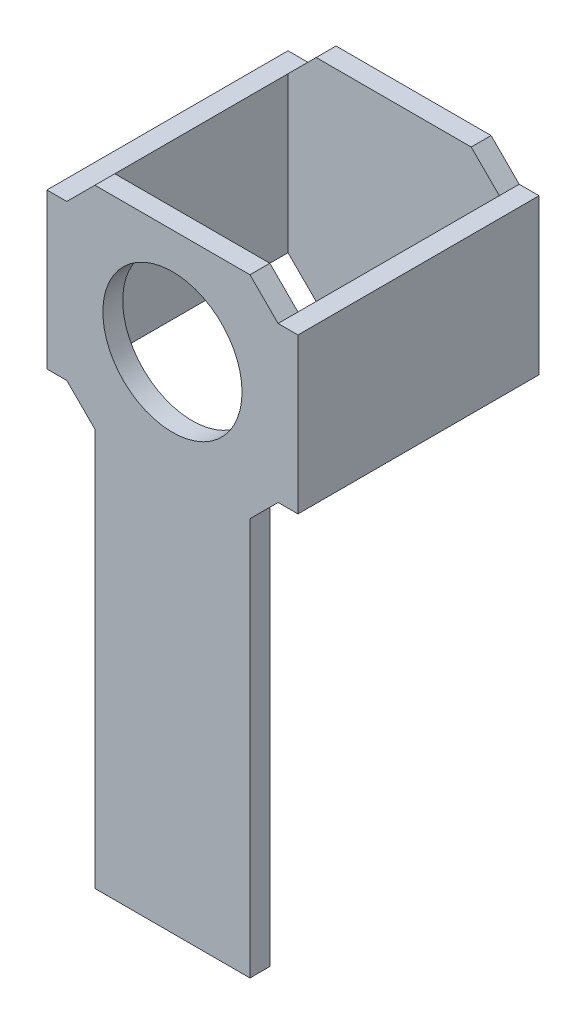
ISO-10303-21;
HEADER;
FILE_DESCRIPTION(('STEP AP214'),'2;1');
FILE_NAME('part.step','',(''),(''),'','','');
FILE_SCHEMA(('AUTOMOTIVE_DESIGN { 1 0 10303 214 1 1 1 1 }'));
ENDSEC;
DATA;
#1=APPLICATION_CONTEXT('core data for automotive mechanical design processes');
#2=APPLICATION_PROTOCOL_DEFINITION('international standard','automotive_design',2000,#1);
#3=PRODUCT_CONTEXT('',#1,'mechanical');
#4=PRODUCT('Part','Part','',(#3));
#5=PRODUCT_RELATED_PRODUCT_CATEGORY('part','',(#4));
#6=PRODUCT_DEFINITION_FORMATION('','',#4);
#7=PRODUCT_DEFINITION_CONTEXT('part definition',#1,'design');
#8=PRODUCT_DEFINITION('design','',#6,#7);
#9=PRODUCT_DEFINITION_SHAPE('','',#8);
#10=(LENGTH_UNIT() NAMED_UNIT(*) SI_UNIT(.MILLI.,.METRE.));
#11=(NAMED_UNIT(*) PLANE_ANGLE_UNIT() SI_UNIT($,.RADIAN.));
#12=(NAMED_UNIT(*) SI_UNIT($,.STERADIAN.) SOLID_ANGLE_UNIT());
#13=UNCERTAINTY_MEASURE_WITH_UNIT(LENGTH_MEASURE(1.E-05),#10,'distance_accuracy_value','');
#14=(GEOMETRIC_REPRESENTATION_CONTEXT(3) GLOBAL_UNCERTAINTY_ASSIGNED_CONTEXT((#13)) GLOBAL_UNIT_ASSIGNED_CONTEXT((#10,
#11,#12)) REPRESENTATION_CONTEXT('',''));
#15=CARTESIAN_POINT('',(0.,0.,0.));
#16=DIRECTION('',(0.,0.,1.));
#17=DIRECTION('',(1.,0.,0.));
#18=AXIS2_PLACEMENT_3D('',#15,#16,#17);
#19=CARTESIAN_POINT('',(0.,0.,4.));
#20=DIRECTION('',(0.,0.,-1.));
#21=DIRECTION('',(-1.,0.,0.));
#22=AXIS2_PLACEMENT_3D('',#19,#20,#21);
#23=PLANE('',#22);
#24=CARTESIAN_POINT('',(0.,0.,4.));
#25=DIRECTION('',(0.,0.,1.));
#26=DIRECTION('',(1.,0.,0.));
#27=AXIS2_PLACEMENT_3D('',#24,#25,#26);
#28=CIRCLE('',#27,14.);
#29=CARTESIAN_POINT('',(14.,0.,4.));
#30=VERTEX_POINT('',#29);
#31=EDGE_CURVE('E230',#30,#30,#28,.T.);
#32=ORIENTED_EDGE('',*,*,#31,.F.);
#33=EDGE_LOOP('',(#32));
#34=FACE_BOUND('',#33,.T.);
#35=DIRECTION('',(0.707106781186556,-0.707106781186539,0.));
#36=VECTOR('',#35,1.);
#37=CARTESIAN_POINT('',(15.5931457505076,21.25,4.));
#38=LINE('',#37,#36);
#39=CARTESIAN_POINT('',(15.5931457505076,21.25,4.));
#40=VERTEX_POINT('',#39);
#41=CARTESIAN_POINT('',(21.25,15.5931457505077,4.));
#42=VERTEX_POINT('',#41);
#43=EDGE_CURVE('E206',#40,#42,#38,.T.);
#44=ORIENTED_EDGE('',*,*,#43,.F.);
#45=DIRECTION('',(-1.,0.,0.));
#46=VECTOR('',#45,1.);
#47=CARTESIAN_POINT('',(21.25,21.25,4.));
#48=LINE('',#47,#46);
#49=CARTESIAN_POINT('',(-15.5931457505077,21.25,4.));
#50=VERTEX_POINT('',#49);
#51=EDGE_CURVE('E218',#40,#50,#48,.T.);
#52=ORIENTED_EDGE('',*,*,#51,.T.);
#53=DIRECTION('',(0.70710678118654,0.707106781186556,0.));
#54=VECTOR('',#53,1.);
#55=CARTESIAN_POINT('',(-15.5931457505077,21.25,4.));
#56=LINE('',#55,#54);
#57=CARTESIAN_POINT('',(-21.25,15.5931457505075,4.));
#58=VERTEX_POINT('',#57);
#59=EDGE_CURVE('E240',#58,#50,#56,.T.);
#60=ORIENTED_EDGE('',*,*,#59,.F.);
#61=DIRECTION('',(1.,0.,0.));
#62=VECTOR('',#61,1.);
#63=CARTESIAN_POINT('',(-25.25,15.5931457505075,4.));
#64=LINE('',#63,#62);
#65=CARTESIAN_POINT('',(-25.25,15.5931457505075,4.));
#66=VERTEX_POINT('',#65);
#67=EDGE_CURVE('E259',#66,#58,#64,.T.);
#68=ORIENTED_EDGE('',*,*,#67,.F.);
#69=DIRECTION('',(0.,1.,0.));
#70=VECTOR('',#69,1.);
#71=CARTESIAN_POINT('',(-25.25,15.5931457505075,4.));
#72=LINE('',#71,#70);
#73=CARTESIAN_POINT('',(-25.25,-15.5931457505077,4.));
#74=VERTEX_POINT('',#73);
#75=EDGE_CURVE('E265',#74,#66,#72,.T.);
#76=ORIENTED_EDGE('',*,*,#75,.F.);
#77=DIRECTION('',(1.,0.,0.));
#78=VECTOR('',#77,1.);
#79=CARTESIAN_POINT('',(-25.25,-15.5931457505077,4.));
#80=LINE('',#79,#78);
#81=CARTESIAN_POINT('',(-21.25,-15.5931457505077,4.));
#82=VERTEX_POINT('',#81);
#83=EDGE_CURVE('E247',#74,#82,#80,.T.);
#84=ORIENTED_EDGE('',*,*,#83,.T.);
#85=DIRECTION('',(-0.707106781186555,0.70710678118654,0.));
#86=VECTOR('',#85,1.);
#87=CARTESIAN_POINT('',(-21.25,-15.5931457505077,4.));
#88=LINE('',#87,#86);
#89=CARTESIAN_POINT('',(-15.5931457505076,-21.25,4.));
#90=VERTEX_POINT('',#89);
#91=EDGE_CURVE('E238',#90,#82,#88,.T.);
#92=ORIENTED_EDGE('',*,*,#91,.F.);
#93=DIRECTION('',(0.,-1.,0.));
#94=VECTOR('',#93,1.);
#95=CARTESIAN_POINT('',(-15.5931457505076,-21.25,4.));
#96=LINE('',#95,#94);
#97=CARTESIAN_POINT('',(-15.5931457505075,-101.25,4.));
#98=VERTEX_POINT('',#97);
#99=EDGE_CURVE('E371',#90,#98,#96,.T.);
#100=ORIENTED_EDGE('',*,*,#99,.T.);
#101=DIRECTION('',(1.,0.,0.));
#102=VECTOR('',#101,1.);
#103=CARTESIAN_POINT('',(15.5931457505077,-101.25,4.));
#104=LINE('',#103,#102);
#105=CARTESIAN_POINT('',(15.5931457505077,-101.25,4.));
#106=VERTEX_POINT('',#105);
#107=EDGE_CURVE('E197',#98,#106,#104,.T.);
#108=ORIENTED_EDGE('',*,*,#107,.T.);
#109=DIRECTION('',(0.,1.,0.));
#110=VECTOR('',#109,1.);
#111=CARTESIAN_POINT('',(15.5931457505077,-21.25,4.));
#112=LINE('',#111,#110);
#113=CARTESIAN_POINT('',(15.5931457505077,-21.25,4.));
#114=VERTEX_POINT('',#113);
#115=EDGE_CURVE('E372',#106,#114,#112,.T.);
#116=ORIENTED_EDGE('',*,*,#115,.T.);
#117=DIRECTION('',(-0.707106781186539,-0.707106781186556,0.));
#118=VECTOR('',#117,1.);
#119=CARTESIAN_POINT('',(15.5931457505077,-21.25,4.));
#120=LINE('',#119,#118);
#121=CARTESIAN_POINT('',(21.25,-15.5931457505076,4.));
#122=VERTEX_POINT('',#121);
#123=EDGE_CURVE('E204',#122,#114,#120,.T.);
#124=ORIENTED_EDGE('',*,*,#123,.F.);
#125=DIRECTION('',(-1.,0.,0.));
#126=VECTOR('',#125,1.);
#127=CARTESIAN_POINT('',(25.25,-15.5931457505077,4.));
#128=LINE('',#127,#126);
#129=CARTESIAN_POINT('',(25.25,-15.5931457505077,4.));
#130=VERTEX_POINT('',#129);
#131=EDGE_CURVE('E275',#130,#122,#128,.T.);
#132=ORIENTED_EDGE('',*,*,#131,.F.);
#133=DIRECTION('',(0.,-1.,0.));
#134=VECTOR('',#133,1.);
#135=CARTESIAN_POINT('',(25.25,15.5931457505075,4.));
#136=LINE('',#135,#134);
#137=CARTESIAN_POINT('',(25.25,15.5931457505075,4.));
#138=VERTEX_POINT('',#137);
#139=EDGE_CURVE('E287',#138,#130,#136,.T.);
#140=ORIENTED_EDGE('',*,*,#139,.F.);
#141=DIRECTION('',(-1.,0.,0.));
#142=VECTOR('',#141,1.);
#143=CARTESIAN_POINT('',(25.25,15.5931457505075,4.));
#144=LINE('',#143,#142);
#145=EDGE_CURVE('E276',#138,#42,#144,.T.);
#146=ORIENTED_EDGE('',*,*,#145,.T.);
#147=EDGE_LOOP('',(#44,#52,#60,#68,#76,#84,#92,#100,#108,#116,#124,#132,#140,#146));
#148=FACE_BOUND('',#147,.T.);
#149=ADVANCED_FACE('F39',(#34,#148),#23,.F.);
#150=CARTESIAN_POINT('',(21.25,21.25,4.));
#151=DIRECTION('',(0.,-1.,0.));
#152=DIRECTION('',(0.,0.,-1.));
#153=AXIS2_PLACEMENT_3D('',#150,#151,#152);
#154=PLANE('',#153);
#155=DIRECTION('',(0.,0.,1.));
#156=VECTOR('',#155,1.);
#157=CARTESIAN_POINT('',(15.5931457505076,21.25,-6.));
#158=LINE('',#157,#156);
#159=CARTESIAN_POINT('',(15.5931457505076,21.25,0.));
#160=VERTEX_POINT('',#159);
#161=EDGE_CURVE('E245',#160,#40,#158,.T.);
#162=ORIENTED_EDGE('',*,*,#161,.F.);
#163=DIRECTION('',(-1.,0.,0.));
#164=VECTOR('',#163,1.);
#165=CARTESIAN_POINT('',(21.25,21.25,0.));
#166=LINE('',#165,#164);
#167=CARTESIAN_POINT('',(-15.5931457505077,21.25,0.));
#168=VERTEX_POINT('',#167);
#169=EDGE_CURVE('E221',#160,#168,#166,.T.);
#170=ORIENTED_EDGE('',*,*,#169,.T.);
#171=DIRECTION('',(0.,0.,1.));
#172=VECTOR('',#171,1.);
#173=CARTESIAN_POINT('',(-15.5931457505077,21.25,-6.));
#174=LINE('',#173,#172);
#175=EDGE_CURVE('E53',#168,#50,#174,.T.);
#176=ORIENTED_EDGE('',*,*,#175,.T.);
#177=ORIENTED_EDGE('',*,*,#51,.F.);
#178=EDGE_LOOP('',(#162,#170,#176,#177));
#179=FACE_BOUND('',#178,.T.);
#180=ADVANCED_FACE('F41',(#179),#154,.F.);
#181=CARTESIAN_POINT('',(0.,0.,0.));
#182=DIRECTION('',(0.,0.,-1.));
#183=DIRECTION('',(-1.,0.,0.));
#184=AXIS2_PLACEMENT_3D('',#181,#182,#183);
#185=PLANE('',#184);
#186=DIRECTION('',(-0.707106781186556,0.707106781186539,0.));
#187=VECTOR('',#186,1.);
#188=CARTESIAN_POINT('',(18.4215728752536,18.421572875254,0.));
#189=LINE('',#188,#187);
#190=CARTESIAN_POINT('',(21.25,15.5931457505075,0.));
#191=VERTEX_POINT('',#190);
#192=EDGE_CURVE('E11',#191,#160,#189,.T.);
#193=ORIENTED_EDGE('',*,*,#192,.F.);
#194=DIRECTION('',(0.,1.,0.));
#195=VECTOR('',#194,1.);
#196=CARTESIAN_POINT('',(21.25,-21.25,0.));
#197=LINE('',#196,#195);
#198=CARTESIAN_POINT('',(21.25,-15.5931457505076,0.));
#199=VERTEX_POINT('',#198);
#200=EDGE_CURVE('E211',#199,#191,#197,.T.);
#201=ORIENTED_EDGE('',*,*,#200,.F.);
#202=DIRECTION('',(0.707106781186539,0.707106781186556,0.));
#203=VECTOR('',#202,1.);
#204=CARTESIAN_POINT('',(18.421572875254,-18.4215728752536,0.));
#205=LINE('',#204,#203);
#206=CARTESIAN_POINT('',(15.5931457505077,-21.25,0.));
#207=VERTEX_POINT('',#206);
#208=EDGE_CURVE('E50',#207,#199,#205,.T.);
#209=ORIENTED_EDGE('',*,*,#208,.F.);
#210=DIRECTION('',(0.,1.,0.));
#211=VECTOR('',#210,1.);
#212=CARTESIAN_POINT('',(15.5931457505077,-21.25,0.));
#213=LINE('',#212,#211);
#214=CARTESIAN_POINT('',(15.5931457505077,-101.25,0.));
#215=VERTEX_POINT('',#214);
#216=EDGE_CURVE('E183',#215,#207,#213,.T.);
#217=ORIENTED_EDGE('',*,*,#216,.F.);
#218=DIRECTION('',(1.,0.,0.));
#219=VECTOR('',#218,1.);
#220=CARTESIAN_POINT('',(15.5931457505077,-101.25,0.));
#221=LINE('',#220,#219);
#222=CARTESIAN_POINT('',(-15.5931457505075,-101.25,0.));
#223=VERTEX_POINT('',#222);
#224=EDGE_CURVE('E370',#223,#215,#221,.T.);
#225=ORIENTED_EDGE('',*,*,#224,.F.);
#226=DIRECTION('',(0.,-1.,0.));
#227=VECTOR('',#226,1.);
#228=CARTESIAN_POINT('',(-15.5931457505076,-21.25,0.));
#229=LINE('',#228,#227);
#230=CARTESIAN_POINT('',(-15.5931457505076,-21.25,0.));
#231=VERTEX_POINT('',#230);
#232=EDGE_CURVE('E198',#231,#223,#229,.T.);
#233=ORIENTED_EDGE('',*,*,#232,.F.);
#234=DIRECTION('',(0.707106781186555,-0.70710678118654,0.));
#235=VECTOR('',#234,1.);
#236=CARTESIAN_POINT('',(-18.4215728752536,-18.421572875254,0.));
#237=LINE('',#236,#235);
#238=CARTESIAN_POINT('',(-21.25,-15.5931457505077,0.));
#239=VERTEX_POINT('',#238);
#240=EDGE_CURVE('E213',#239,#231,#237,.T.);
#241=ORIENTED_EDGE('',*,*,#240,.F.);
#242=DIRECTION('',(0.,-1.,0.));
#243=VECTOR('',#242,1.);
#244=CARTESIAN_POINT('',(-21.25,-21.25,0.));
#245=LINE('',#244,#243);
#246=CARTESIAN_POINT('',(-21.25,15.5931457505075,0.));
#247=VERTEX_POINT('',#246);
#248=EDGE_CURVE('E222',#247,#239,#245,.T.);
#249=ORIENTED_EDGE('',*,*,#248,.F.);
#250=DIRECTION('',(-0.707106781186539,-0.707106781186556,0.));
#251=VECTOR('',#250,1.);
#252=CARTESIAN_POINT('',(-18.421572875254,18.4215728752536,0.));
#253=LINE('',#252,#251);
#254=EDGE_CURVE('E214',#168,#247,#253,.T.);
#255=ORIENTED_EDGE('',*,*,#254,.F.);
#256=ORIENTED_EDGE('',*,*,#169,.F.);
#257=EDGE_LOOP('',(#193,#201,#209,#217,#225,#233,#241,#249,#255,#256));
#258=FACE_BOUND('',#257,.T.);
#259=CARTESIAN_POINT('',(0.,0.,0.));
#260=DIRECTION('',(0.,0.,1.));
#261=DIRECTION('',(1.,0.,0.));
#262=AXIS2_PLACEMENT_3D('',#259,#260,#261);
#263=CIRCLE('',#262,14.);
#264=CARTESIAN_POINT('',(14.,0.,0.));
#265=VERTEX_POINT('',#264);
#266=EDGE_CURVE('E227',#265,#265,#263,.T.);
#267=ORIENTED_EDGE('',*,*,#266,.T.);
#268=EDGE_LOOP('',(#267));
#269=FACE_BOUND('',#268,.T.);
#270=ADVANCED_FACE('F208',(#258,#269),#185,.T.);
#271=CARTESIAN_POINT('',(0.,0.,4.));
#272=DIRECTION('',(0.,0.,-1.));
#273=DIRECTION('',(-1.,0.,0.));
#274=AXIS2_PLACEMENT_3D('',#271,#272,#273);
#275=CYLINDRICAL_SURFACE('',#274,14.);
#276=ORIENTED_EDGE('',*,*,#31,.T.);
#277=EDGE_LOOP('',(#276));
#278=FACE_BOUND('',#277,.T.);
#279=ORIENTED_EDGE('',*,*,#266,.F.);
#280=EDGE_LOOP('',(#279));
#281=FACE_BOUND('',#280,.T.);
#282=ADVANCED_FACE('F485',(#278,#281),#275,.F.);
#283=CARTESIAN_POINT('',(-15.5931457505077,21.25,-6.));
#284=DIRECTION('',(0.707106781186556,-0.70710678118654,0.));
#285=DIRECTION('',(0.707106781186539,0.707106781186556,0.));
#286=AXIS2_PLACEMENT_3D('',#283,#284,#285);
#287=PLANE('',#286);
#288=ORIENTED_EDGE('',*,*,#254,.T.);
#289=DIRECTION('',(0.,0.,1.));
#290=VECTOR('',#289,1.);
#291=CARTESIAN_POINT('',(-21.25,15.5931457505075,-6.));
#292=LINE('',#291,#290);
#293=EDGE_CURVE('E231',#247,#58,#292,.T.);
#294=ORIENTED_EDGE('',*,*,#293,.T.);
#295=ORIENTED_EDGE('',*,*,#59,.T.);
#296=ORIENTED_EDGE('',*,*,#175,.F.);
#297=EDGE_LOOP('',(#288,#294,#295,#296));
#298=FACE_BOUND('',#297,.T.);
#299=ADVANCED_FACE('F401',(#298),#287,.F.);
#300=CARTESIAN_POINT('',(-21.25,-15.5931457505077,-6.));
#301=DIRECTION('',(0.70710678118654,0.707106781186555,0.));
#302=DIRECTION('',(-0.707106781186555,0.70710678118654,0.));
#303=AXIS2_PLACEMENT_3D('',#300,#301,#302);
#304=PLANE('',#303);
#305=ORIENTED_EDGE('',*,*,#240,.T.);
#306=DIRECTION('',(0.,0.,1.));
#307=VECTOR('',#306,1.);
#308=CARTESIAN_POINT('',(-15.5931457505076,-21.25,-6.));
#309=LINE('',#308,#307);
#310=EDGE_CURVE('E252',#231,#90,#309,.T.);
#311=ORIENTED_EDGE('',*,*,#310,.T.);
#312=ORIENTED_EDGE('',*,*,#91,.T.);
#313=DIRECTION('',(0.,0.,1.));
#314=VECTOR('',#313,1.);
#315=CARTESIAN_POINT('',(-21.25,-15.5931457505077,-6.));
#316=LINE('',#315,#314);
#317=EDGE_CURVE('E248',#239,#82,#316,.T.);
#318=ORIENTED_EDGE('',*,*,#317,.F.);
#319=EDGE_LOOP('',(#305,#311,#312,#318));
#320=FACE_BOUND('',#319,.T.);
#321=ADVANCED_FACE('F389',(#320),#304,.F.);
#322=CARTESIAN_POINT('',(15.5931457505077,-21.25,-6.));
#323=DIRECTION('',(-0.707106781186556,0.707106781186539,0.));
#324=DIRECTION('',(-0.707106781186539,-0.707106781186556,0.));
#325=AXIS2_PLACEMENT_3D('',#322,#323,#324);
#326=PLANE('',#325);
#327=ORIENTED_EDGE('',*,*,#208,.T.);
#328=DIRECTION('',(0.,0.,1.));
#329=VECTOR('',#328,1.);
#330=CARTESIAN_POINT('',(21.25,-15.5931457505076,-6.));
#331=LINE('',#330,#329);
#332=EDGE_CURVE('E202',#199,#122,#331,.T.);
#333=ORIENTED_EDGE('',*,*,#332,.T.);
#334=ORIENTED_EDGE('',*,*,#123,.T.);
#335=DIRECTION('',(0.,0.,1.));
#336=VECTOR('',#335,1.);
#337=CARTESIAN_POINT('',(15.5931457505077,-21.25,-6.));
#338=LINE('',#337,#336);
#339=EDGE_CURVE('E189',#207,#114,#338,.T.);
#340=ORIENTED_EDGE('',*,*,#339,.F.);
#341=EDGE_LOOP('',(#327,#333,#334,#340));
#342=FACE_BOUND('',#341,.T.);
#343=ADVANCED_FACE('F203',(#342),#326,.F.);
#344=CARTESIAN_POINT('',(15.5931457505076,21.25,-6.));
#345=DIRECTION('',(-0.707106781186539,-0.707106781186556,0.));
#346=DIRECTION('',(0.707106781186556,-0.707106781186539,0.));
#347=AXIS2_PLACEMENT_3D('',#344,#345,#346);
#348=PLANE('',#347);
#349=ORIENTED_EDGE('',*,*,#192,.T.);
#350=ORIENTED_EDGE('',*,*,#161,.T.);
#351=ORIENTED_EDGE('',*,*,#43,.T.);
#352=DIRECTION('',(0.,0.,1.));
#353=VECTOR('',#352,1.);
#354=CARTESIAN_POINT('',(21.25,15.5931457505077,-6.));
#355=LINE('',#354,#353);
#356=EDGE_CURVE('E241',#191,#42,#355,.T.);
#357=ORIENTED_EDGE('',*,*,#356,.F.);
#358=EDGE_LOOP('',(#349,#350,#351,#357));
#359=FACE_BOUND('',#358,.T.);
#360=ADVANCED_FACE('F410',(#359),#348,.F.);
#361=CARTESIAN_POINT('',(-21.25,0.,0.));
#362=DIRECTION('',(-1.,0.,0.));
#363=DIRECTION('',(0.,0.,1.));
#364=AXIS2_PLACEMENT_3D('',#361,#362,#363);
#365=PLANE('',#364);
#366=DIRECTION('',(0.,0.,-1.));
#367=VECTOR('',#366,1.);
#368=CARTESIAN_POINT('',(-21.25,15.5931457505075,4.));
#369=LINE('',#368,#367);
#370=CARTESIAN_POINT('',(-21.25,15.5931457505075,-40.5));
#371=VERTEX_POINT('',#370);
#372=EDGE_CURVE('E269',#247,#371,#369,.T.);
#373=ORIENTED_EDGE('',*,*,#372,.F.);
#374=ORIENTED_EDGE('',*,*,#248,.T.);
#375=DIRECTION('',(0.,0.,1.));
#376=VECTOR('',#375,1.);
#377=CARTESIAN_POINT('',(-21.25,-15.5931457505077,4.));
#378=LINE('',#377,#376);
#379=CARTESIAN_POINT('',(-21.25,-15.5931457505077,-40.5));
#380=VERTEX_POINT('',#379);
#381=EDGE_CURVE('E263',#380,#239,#378,.T.);
#382=ORIENTED_EDGE('',*,*,#381,.F.);
#383=DIRECTION('',(0.,-1.,0.));
#384=VECTOR('',#383,1.);
#385=CARTESIAN_POINT('',(-21.25,15.5931457505075,-40.5));
#386=LINE('',#385,#384);
#387=EDGE_CURVE('E270',#371,#380,#386,.T.);
#388=ORIENTED_EDGE('',*,*,#387,.F.);
#389=EDGE_LOOP('',(#373,#374,#382,#388));
#390=FACE_BOUND('',#389,.T.);
#391=ADVANCED_FACE('F397',(#390),#365,.F.);
#392=CARTESIAN_POINT('',(-25.25,15.5931457505075,4.));
#393=DIRECTION('',(0.,-1.,0.));
#394=DIRECTION('',(0.,0.,-1.));
#395=AXIS2_PLACEMENT_3D('',#392,#393,#394);
#396=PLANE('',#395);
#397=ORIENTED_EDGE('',*,*,#293,.F.);
#398=ORIENTED_EDGE('',*,*,#372,.T.);
#399=DIRECTION('',(0.,0.,1.));
#400=VECTOR('',#399,1.);
#401=CARTESIAN_POINT('',(-21.25,15.5931457505075,-44.5));
#402=LINE('',#401,#400);
#403=CARTESIAN_POINT('',(-21.25,15.5931457505075,-44.5));
#404=VERTEX_POINT('',#403);
#405=EDGE_CURVE('E312',#404,#371,#402,.T.);
#406=ORIENTED_EDGE('',*,*,#405,.F.);
#407=DIRECTION('',(1.,0.,0.));
#408=VECTOR('',#407,1.);
#409=CARTESIAN_POINT('',(-25.25,15.5931457505075,-44.5));
#410=LINE('',#409,#408);
#411=CARTESIAN_POINT('',(-25.25,15.5931457505075,-44.5));
#412=VERTEX_POINT('',#411);
#413=EDGE_CURVE('E339',#412,#404,#410,.T.);
#414=ORIENTED_EDGE('',*,*,#413,.F.);
#415=DIRECTION('',(0.,0.,-1.));
#416=VECTOR('',#415,1.);
#417=CARTESIAN_POINT('',(-25.25,15.5931457505075,4.));
#418=LINE('',#417,#416);
#419=EDGE_CURVE('E266',#66,#412,#418,.T.);
#420=ORIENTED_EDGE('',*,*,#419,.F.);
#421=ORIENTED_EDGE('',*,*,#67,.T.);
#422=EDGE_LOOP('',(#397,#398,#406,#414,#420,#421));
#423=FACE_BOUND('',#422,.T.);
#424=ADVANCED_FACE('F399',(#423),#396,.F.);
#425=CARTESIAN_POINT('',(-25.25,-15.5931457505077,4.));
#426=DIRECTION('',(0.,1.,0.));
#427=DIRECTION('',(0.,0.,1.));
#428=AXIS2_PLACEMENT_3D('',#425,#426,#427);
#429=PLANE('',#428);
#430=ORIENTED_EDGE('',*,*,#381,.T.);
#431=ORIENTED_EDGE('',*,*,#317,.T.);
#432=ORIENTED_EDGE('',*,*,#83,.F.);
#433=DIRECTION('',(0.,0.,1.));
#434=VECTOR('',#433,1.);
#435=CARTESIAN_POINT('',(-25.25,-15.5931457505077,4.));
#436=LINE('',#435,#434);
#437=CARTESIAN_POINT('',(-25.25,-15.5931457505077,-44.5));
#438=VERTEX_POINT('',#437);
#439=EDGE_CURVE('E273',#438,#74,#436,.T.);
#440=ORIENTED_EDGE('',*,*,#439,.F.);
#441=DIRECTION('',(-1.,0.,0.));
#442=VECTOR('',#441,1.);
#443=CARTESIAN_POINT('',(-21.25,-15.5931457505077,-44.5));
#444=LINE('',#443,#442);
#445=CARTESIAN_POINT('',(-21.25,-15.5931457505077,-44.5));
#446=VERTEX_POINT('',#445);
#447=EDGE_CURVE('E344',#446,#438,#444,.T.);
#448=ORIENTED_EDGE('',*,*,#447,.F.);
#449=DIRECTION('',(0.,0.,1.));
#450=VECTOR('',#449,1.);
#451=CARTESIAN_POINT('',(-21.25,-15.5931457505077,-44.5));
#452=LINE('',#451,#450);
#453=EDGE_CURVE('E315',#446,#380,#452,.T.);
#454=ORIENTED_EDGE('',*,*,#453,.T.);
#455=EDGE_LOOP('',(#430,#431,#432,#440,#448,#454));
#456=FACE_BOUND('',#455,.T.);
#457=ADVANCED_FACE('F457',(#456),#429,.F.);
#458=CARTESIAN_POINT('',(-25.25,0.,0.));
#459=DIRECTION('',(-1.,0.,0.));
#460=DIRECTION('',(0.,0.,1.));
#461=AXIS2_PLACEMENT_3D('',#458,#459,#460);
#462=PLANE('',#461);
#463=ORIENTED_EDGE('',*,*,#419,.T.);
#464=DIRECTION('',(0.,1.,0.));
#465=VECTOR('',#464,1.);
#466=CARTESIAN_POINT('',(-25.25,-15.5931457505077,-44.5));
#467=LINE('',#466,#465);
#468=EDGE_CURVE('E342',#438,#412,#467,.T.);
#469=ORIENTED_EDGE('',*,*,#468,.F.);
#470=ORIENTED_EDGE('',*,*,#439,.T.);
#471=ORIENTED_EDGE('',*,*,#75,.T.);
#472=EDGE_LOOP('',(#463,#469,#470,#471));
#473=FACE_BOUND('',#472,.T.);
#474=ADVANCED_FACE('F463',(#473),#462,.T.);
#475=CARTESIAN_POINT('',(21.25,0.,0.));
#476=DIRECTION('',(1.,0.,0.));
#477=DIRECTION('',(0.,0.,-1.));
#478=AXIS2_PLACEMENT_3D('',#475,#476,#477);
#479=PLANE('',#478);
#480=DIRECTION('',(0.,0.,-1.));
#481=VECTOR('',#480,1.);
#482=CARTESIAN_POINT('',(21.25,-15.5931457505077,4.));
#483=LINE('',#482,#481);
#484=CARTESIAN_POINT('',(21.25,-15.5931457505077,-40.5));
#485=VERTEX_POINT('',#484);
#486=EDGE_CURVE('E286',#199,#485,#483,.T.);
#487=ORIENTED_EDGE('',*,*,#486,.F.);
#488=ORIENTED_EDGE('',*,*,#200,.T.);
#489=DIRECTION('',(0.,0.,1.));
#490=VECTOR('',#489,1.);
#491=CARTESIAN_POINT('',(21.25,15.5931457505075,-40.5));
#492=LINE('',#491,#490);
#493=CARTESIAN_POINT('',(21.25,15.5931457505075,-40.5));
#494=VERTEX_POINT('',#493);
#495=EDGE_CURVE('E281',#494,#191,#492,.T.);
#496=ORIENTED_EDGE('',*,*,#495,.F.);
#497=DIRECTION('',(0.,1.,0.));
#498=VECTOR('',#497,1.);
#499=CARTESIAN_POINT('',(21.25,-15.5931457505077,-40.5));
#500=LINE('',#499,#498);
#501=EDGE_CURVE('E290',#485,#494,#500,.T.);
#502=ORIENTED_EDGE('',*,*,#501,.F.);
#503=EDGE_LOOP('',(#487,#488,#496,#502));
#504=FACE_BOUND('',#503,.T.);
#505=ADVANCED_FACE('F412',(#504),#479,.F.);
#506=CARTESIAN_POINT('',(25.25,-15.5931457505077,4.));
#507=DIRECTION('',(0.,1.,0.));
#508=DIRECTION('',(0.,0.,1.));
#509=AXIS2_PLACEMENT_3D('',#506,#507,#508);
#510=PLANE('',#509);
#511=ORIENTED_EDGE('',*,*,#332,.F.);
#512=ORIENTED_EDGE('',*,*,#486,.T.);
#513=DIRECTION('',(0.,0.,1.));
#514=VECTOR('',#513,1.);
#515=CARTESIAN_POINT('',(21.25,-15.5931457505076,-44.5));
#516=LINE('',#515,#514);
#517=CARTESIAN_POINT('',(21.25,-15.5931457505076,-44.5));
#518=VERTEX_POINT('',#517);
#519=EDGE_CURVE('E303',#518,#485,#516,.T.);
#520=ORIENTED_EDGE('',*,*,#519,.F.);
#521=DIRECTION('',(-1.,0.,0.));
#522=VECTOR('',#521,1.);
#523=CARTESIAN_POINT('',(21.25,-15.5931457505076,-44.5));
#524=LINE('',#523,#522);
#525=CARTESIAN_POINT('',(25.25,-15.5931457505077,-44.5));
#526=VERTEX_POINT('',#525);
#527=EDGE_CURVE('E351',#526,#518,#524,.T.);
#528=ORIENTED_EDGE('',*,*,#527,.F.);
#529=DIRECTION('',(0.,0.,-1.));
#530=VECTOR('',#529,1.);
#531=CARTESIAN_POINT('',(25.25,-15.5931457505077,4.));
#532=LINE('',#531,#530);
#533=EDGE_CURVE('E294',#130,#526,#532,.T.);
#534=ORIENTED_EDGE('',*,*,#533,.F.);
#535=ORIENTED_EDGE('',*,*,#131,.T.);
#536=EDGE_LOOP('',(#511,#512,#520,#528,#534,#535));
#537=FACE_BOUND('',#536,.T.);
#538=ADVANCED_FACE('F433',(#537),#510,.F.);
#539=CARTESIAN_POINT('',(25.25,15.5931457505075,-40.5));
#540=DIRECTION('',(0.,-1.,0.));
#541=DIRECTION('',(0.,0.,-1.));
#542=AXIS2_PLACEMENT_3D('',#539,#540,#541);
#543=PLANE('',#542);
#544=ORIENTED_EDGE('',*,*,#495,.T.);
#545=ORIENTED_EDGE('',*,*,#356,.T.);
#546=ORIENTED_EDGE('',*,*,#145,.F.);
#547=DIRECTION('',(0.,0.,1.));
#548=VECTOR('',#547,1.);
#549=CARTESIAN_POINT('',(25.25,15.5931457505075,-40.5));
#550=LINE('',#549,#548);
#551=CARTESIAN_POINT('',(25.25,15.5931457505075,-44.5));
#552=VERTEX_POINT('',#551);
#553=EDGE_CURVE('E285',#552,#138,#550,.T.);
#554=ORIENTED_EDGE('',*,*,#553,.F.);
#555=DIRECTION('',(1.,0.,0.));
#556=VECTOR('',#555,1.);
#557=CARTESIAN_POINT('',(25.25,15.5931457505075,-44.5));
#558=LINE('',#557,#556);
#559=CARTESIAN_POINT('',(21.25,15.5931457505075,-44.5));
#560=VERTEX_POINT('',#559);
#561=EDGE_CURVE('E358',#560,#552,#558,.T.);
#562=ORIENTED_EDGE('',*,*,#561,.F.);
#563=DIRECTION('',(0.,0.,1.));
#564=VECTOR('',#563,1.);
#565=CARTESIAN_POINT('',(21.25,15.5931457505075,-44.5));
#566=LINE('',#565,#564);
#567=EDGE_CURVE('E297',#560,#494,#566,.T.);
#568=ORIENTED_EDGE('',*,*,#567,.T.);
#569=EDGE_LOOP('',(#544,#545,#546,#554,#562,#568));
#570=FACE_BOUND('',#569,.T.);
#571=ADVANCED_FACE('F414',(#570),#543,.F.);
#572=CARTESIAN_POINT('',(25.25,0.,0.));
#573=DIRECTION('',(1.,0.,0.));
#574=DIRECTION('',(0.,0.,-1.));
#575=AXIS2_PLACEMENT_3D('',#572,#573,#574);
#576=PLANE('',#575);
#577=ORIENTED_EDGE('',*,*,#139,.T.);
#578=ORIENTED_EDGE('',*,*,#533,.T.);
#579=DIRECTION('',(0.,-1.,0.));
#580=VECTOR('',#579,1.);
#581=CARTESIAN_POINT('',(25.25,-15.5931457505077,-44.5));
#582=LINE('',#581,#580);
#583=EDGE_CURVE('E352',#552,#526,#582,.T.);
#584=ORIENTED_EDGE('',*,*,#583,.F.);
#585=ORIENTED_EDGE('',*,*,#553,.T.);
#586=EDGE_LOOP('',(#577,#578,#584,#585));
#587=FACE_BOUND('',#586,.T.);
#588=ADVANCED_FACE('F440',(#587),#576,.T.);
#589=CARTESIAN_POINT('',(-15.5931457505077,21.25,-44.5));
#590=DIRECTION('',(0.,-1.,0.));
#591=DIRECTION('',(1.,0.,0.));
#592=AXIS2_PLACEMENT_3D('',#589,#590,#591);
#593=PLANE('',#592);
#594=DIRECTION('',(1.,0.,0.));
#595=VECTOR('',#594,1.);
#596=CARTESIAN_POINT('',(-15.5931457505077,21.25,-40.5));
#597=LINE('',#596,#595);
#598=CARTESIAN_POINT('',(-15.5931457505077,21.25,-40.5));
#599=VERTEX_POINT('',#598);
#600=CARTESIAN_POINT('',(15.5931457505076,21.25,-40.5));
#601=VERTEX_POINT('',#600);
#602=EDGE_CURVE('E333',#599,#601,#597,.T.);
#603=ORIENTED_EDGE('',*,*,#602,.T.);
#604=DIRECTION('',(0.,0.,1.));
#605=VECTOR('',#604,1.);
#606=CARTESIAN_POINT('',(15.5931457505076,21.25,-44.5));
#607=LINE('',#606,#605);
#608=CARTESIAN_POINT('',(15.5931457505076,21.25,-44.5));
#609=VERTEX_POINT('',#608);
#610=EDGE_CURVE('E295',#609,#601,#607,.T.);
#611=ORIENTED_EDGE('',*,*,#610,.F.);
#612=DIRECTION('',(1.,0.,0.));
#613=VECTOR('',#612,1.);
#614=CARTESIAN_POINT('',(-15.5931457505077,21.25,-44.5));
#615=LINE('',#614,#613);
#616=CARTESIAN_POINT('',(-15.5931457505077,21.25,-44.5));
#617=VERTEX_POINT('',#616);
#618=EDGE_CURVE('E322',#617,#609,#615,.T.);
#619=ORIENTED_EDGE('',*,*,#618,.F.);
#620=DIRECTION('',(0.,0.,1.));
#621=VECTOR('',#620,1.);
#622=CARTESIAN_POINT('',(-15.5931457505077,21.25,-44.5));
#623=LINE('',#622,#621);
#624=EDGE_CURVE('E318',#617,#599,#623,.T.);
#625=ORIENTED_EDGE('',*,*,#624,.T.);
#626=EDGE_LOOP('',(#603,#611,#619,#625));
#627=FACE_BOUND('',#626,.T.);
#628=ADVANCED_FACE('F443',(#627),#593,.F.);
#629=CARTESIAN_POINT('',(15.5931457505076,21.25,-44.5));
#630=DIRECTION('',(-0.707106781186547,-0.707106781186548,0.));
#631=DIRECTION('',(0.707106781186548,-0.707106781186547,0.));
#632=AXIS2_PLACEMENT_3D('',#629,#630,#631);
#633=PLANE('',#632);
#634=DIRECTION('',(0.707106781186548,-0.707106781186547,0.));
#635=VECTOR('',#634,1.);
#636=CARTESIAN_POINT('',(15.5931457505076,21.25,-40.5));
#637=LINE('',#636,#635);
#638=EDGE_CURVE('E335',#601,#494,#637,.T.);
#639=ORIENTED_EDGE('',*,*,#638,.T.);
#640=ORIENTED_EDGE('',*,*,#567,.F.);
#641=DIRECTION('',(0.707106781186548,-0.707106781186547,0.));
#642=VECTOR('',#641,1.);
#643=CARTESIAN_POINT('',(15.5931457505076,21.25,-44.5));
#644=LINE('',#643,#642);
#645=EDGE_CURVE('E363',#609,#560,#644,.T.);
#646=ORIENTED_EDGE('',*,*,#645,.F.);
#647=ORIENTED_EDGE('',*,*,#610,.T.);
#648=EDGE_LOOP('',(#639,#640,#646,#647));
#649=FACE_BOUND('',#648,.T.);
#650=ADVANCED_FACE('F416',(#649),#633,.F.);
#651=CARTESIAN_POINT('',(21.25,-15.5931457505076,-44.5));
#652=DIRECTION('',(-0.707106781186556,0.707106781186539,0.));
#653=DIRECTION('',(-0.707106781186539,-0.707106781186556,0.));
#654=AXIS2_PLACEMENT_3D('',#651,#652,#653);
#655=PLANE('',#654);
#656=DIRECTION('',(-0.707106781186539,-0.707106781186556,0.));
#657=VECTOR('',#656,1.);
#658=CARTESIAN_POINT('',(21.25,-15.5931457505076,-40.5));
#659=LINE('',#658,#657);
#660=CARTESIAN_POINT('',(15.5931457505077,-21.25,-40.5));
#661=VERTEX_POINT('',#660);
#662=EDGE_CURVE('E329',#485,#661,#659,.T.);
#663=ORIENTED_EDGE('',*,*,#662,.T.);
#664=DIRECTION('',(0.,0.,1.));
#665=VECTOR('',#664,1.);
#666=CARTESIAN_POINT('',(15.5931457505077,-21.25,-44.5));
#667=LINE('',#666,#665);
#668=CARTESIAN_POINT('',(15.5931457505077,-21.25,-44.5));
#669=VERTEX_POINT('',#668);
#670=EDGE_CURVE('E308',#669,#661,#667,.T.);
#671=ORIENTED_EDGE('',*,*,#670,.F.);
#672=DIRECTION('',(-0.707106781186539,-0.707106781186556,0.));
#673=VECTOR('',#672,1.);
#674=CARTESIAN_POINT('',(21.25,-15.5931457505076,-44.5));
#675=LINE('',#674,#673);
#676=EDGE_CURVE('E353',#518,#669,#675,.T.);
#677=ORIENTED_EDGE('',*,*,#676,.F.);
#678=ORIENTED_EDGE('',*,*,#519,.T.);
#679=EDGE_LOOP('',(#663,#671,#677,#678));
#680=FACE_BOUND('',#679,.T.);
#681=ADVANCED_FACE('F427',(#680),#655,.F.);
#682=CARTESIAN_POINT('',(15.5931457505077,-21.25,-44.5));
#683=DIRECTION('',(0.,1.,0.));
#684=DIRECTION('',(-1.,0.,0.));
#685=AXIS2_PLACEMENT_3D('',#682,#683,#684);
#686=PLANE('',#685);
#687=DIRECTION('',(-1.,0.,0.));
#688=VECTOR('',#687,1.);
#689=CARTESIAN_POINT('',(15.5931457505077,-21.25,-40.5));
#690=LINE('',#689,#688);
#691=CARTESIAN_POINT('',(-15.5931457505076,-21.25,-40.5));
#692=VERTEX_POINT('',#691);
#693=EDGE_CURVE('E327',#661,#692,#690,.T.);
#694=ORIENTED_EDGE('',*,*,#693,.T.);
#695=DIRECTION('',(0.,0.,1.));
#696=VECTOR('',#695,1.);
#697=CARTESIAN_POINT('',(-15.5931457505076,-21.25,-44.5));
#698=LINE('',#697,#696);
#699=CARTESIAN_POINT('',(-15.5931457505076,-21.25,-44.5));
#700=VERTEX_POINT('',#699);
#701=EDGE_CURVE('E310',#700,#692,#698,.T.);
#702=ORIENTED_EDGE('',*,*,#701,.F.);
#703=DIRECTION('',(-1.,0.,0.));
#704=VECTOR('',#703,1.);
#705=CARTESIAN_POINT('',(15.5931457505077,-21.25,-44.5));
#706=LINE('',#705,#704);
#707=EDGE_CURVE('E349',#669,#700,#706,.T.);
#708=ORIENTED_EDGE('',*,*,#707,.F.);
#709=ORIENTED_EDGE('',*,*,#670,.T.);
#710=EDGE_LOOP('',(#694,#702,#708,#709));
#711=FACE_BOUND('',#710,.T.);
#712=ADVANCED_FACE('F585',(#711),#686,.F.);
#713=CARTESIAN_POINT('',(-15.5931457505076,-21.25,-44.5));
#714=DIRECTION('',(0.70710678118654,0.707106781186555,0.));
#715=DIRECTION('',(-0.707106781186555,0.70710678118654,0.));
#716=AXIS2_PLACEMENT_3D('',#713,#714,#715);
#717=PLANE('',#716);
#718=DIRECTION('',(-0.707106781186555,0.70710678118654,0.));
#719=VECTOR('',#718,1.);
#720=CARTESIAN_POINT('',(-15.5931457505076,-21.25,-40.5));
#721=LINE('',#720,#719);
#722=EDGE_CURVE('E324',#692,#380,#721,.T.);
#723=ORIENTED_EDGE('',*,*,#722,.T.);
#724=ORIENTED_EDGE('',*,*,#453,.F.);
#725=DIRECTION('',(-0.707106781186555,0.70710678118654,0.));
#726=VECTOR('',#725,1.);
#727=CARTESIAN_POINT('',(-15.5931457505076,-21.25,-44.5));
#728=LINE('',#727,#726);
#729=EDGE_CURVE('E350',#700,#446,#728,.T.);
#730=ORIENTED_EDGE('',*,*,#729,.F.);
#731=ORIENTED_EDGE('',*,*,#701,.T.);
#732=EDGE_LOOP('',(#723,#724,#730,#731));
#733=FACE_BOUND('',#732,.T.);
#734=ADVANCED_FACE('F452',(#733),#717,.F.);
#735=CARTESIAN_POINT('',(-21.25,15.5931457505075,-44.5));
#736=DIRECTION('',(0.707106781186556,-0.707106781186539,0.));
#737=DIRECTION('',(0.707106781186539,0.707106781186556,0.));
#738=AXIS2_PLACEMENT_3D('',#735,#736,#737);
#739=PLANE('',#738);
#740=DIRECTION('',(0.707106781186539,0.707106781186556,0.));
#741=VECTOR('',#740,1.);
#742=CARTESIAN_POINT('',(-21.25,15.5931457505075,-40.5));
#743=LINE('',#742,#741);
#744=EDGE_CURVE('E325',#371,#599,#743,.T.);
#745=ORIENTED_EDGE('',*,*,#744,.T.);
#746=ORIENTED_EDGE('',*,*,#624,.F.);
#747=DIRECTION('',(0.707106781186539,0.707106781186556,0.));
#748=VECTOR('',#747,1.);
#749=CARTESIAN_POINT('',(-21.25,15.5931457505075,-44.5));
#750=LINE('',#749,#748);
#751=EDGE_CURVE('E321',#404,#617,#750,.T.);
#752=ORIENTED_EDGE('',*,*,#751,.F.);
#753=ORIENTED_EDGE('',*,*,#405,.T.);
#754=EDGE_LOOP('',(#745,#746,#752,#753));
#755=FACE_BOUND('',#754,.T.);
#756=ADVANCED_FACE('F450',(#755),#739,.F.);
#757=CARTESIAN_POINT('',(0.,0.,-44.5));
#758=DIRECTION('',(0.,0.,1.));
#759=DIRECTION('',(1.,0.,0.));
#760=AXIS2_PLACEMENT_3D('',#757,#758,#759);
#761=PLANE('',#760);
#762=ORIENTED_EDGE('',*,*,#618,.T.);
#763=ORIENTED_EDGE('',*,*,#645,.T.);
#764=ORIENTED_EDGE('',*,*,#561,.T.);
#765=ORIENTED_EDGE('',*,*,#583,.T.);
#766=ORIENTED_EDGE('',*,*,#527,.T.);
#767=ORIENTED_EDGE('',*,*,#676,.T.);
#768=ORIENTED_EDGE('',*,*,#707,.T.);
#769=ORIENTED_EDGE('',*,*,#729,.T.);
#770=ORIENTED_EDGE('',*,*,#447,.T.);
#771=ORIENTED_EDGE('',*,*,#468,.T.);
#772=ORIENTED_EDGE('',*,*,#413,.T.);
#773=ORIENTED_EDGE('',*,*,#751,.T.);
#774=EDGE_LOOP('',(#762,#763,#764,#765,#766,#767,#768,#769,#770,#771,#772,#773));
#775=FACE_BOUND('',#774,.T.);
#776=ADVANCED_FACE('F439',(#775),#761,.F.);
#777=CARTESIAN_POINT('',(0.,0.,-40.5));
#778=DIRECTION('',(0.,0.,1.));
#779=DIRECTION('',(1.,0.,0.));
#780=AXIS2_PLACEMENT_3D('',#777,#778,#779);
#781=PLANE('',#780);
#782=ORIENTED_EDGE('',*,*,#744,.F.);
#783=ORIENTED_EDGE('',*,*,#387,.T.);
#784=ORIENTED_EDGE('',*,*,#722,.F.);
#785=ORIENTED_EDGE('',*,*,#693,.F.);
#786=ORIENTED_EDGE('',*,*,#662,.F.);
#787=ORIENTED_EDGE('',*,*,#501,.T.);
#788=ORIENTED_EDGE('',*,*,#638,.F.);
#789=ORIENTED_EDGE('',*,*,#602,.F.);
#790=EDGE_LOOP('',(#782,#783,#784,#785,#786,#787,#788,#789));
#791=FACE_BOUND('',#790,.T.);
#792=ADVANCED_FACE('F421',(#791),#781,.T.);
#793=CARTESIAN_POINT('',(15.5931457505077,-21.25,0.));
#794=DIRECTION('',(1.,0.,0.));
#795=DIRECTION('',(0.,1.,0.));
#796=AXIS2_PLACEMENT_3D('',#793,#794,#795);
#797=PLANE('',#796);
#798=ORIENTED_EDGE('',*,*,#115,.F.);
#799=DIRECTION('',(0.,0.,1.));
#800=VECTOR('',#799,1.);
#801=CARTESIAN_POINT('',(15.5931457505077,-101.25,0.));
#802=LINE('',#801,#800);
#803=EDGE_CURVE('E192',#215,#106,#802,.T.);
#804=ORIENTED_EDGE('',*,*,#803,.F.);
#805=ORIENTED_EDGE('',*,*,#216,.T.);
#806=ORIENTED_EDGE('',*,*,#339,.T.);
#807=EDGE_LOOP('',(#798,#804,#805,#806));
#808=FACE_BOUND('',#807,.T.);
#809=ADVANCED_FACE('F186',(#808),#797,.T.);
#810=CARTESIAN_POINT('',(15.5931457505077,-101.25,0.));
#811=DIRECTION('',(0.,-1.,0.));
#812=DIRECTION('',(0.,0.,-1.));
#813=AXIS2_PLACEMENT_3D('',#810,#811,#812);
#814=PLANE('',#813);
#815=ORIENTED_EDGE('',*,*,#107,.F.);
#816=DIRECTION('',(0.,0.,1.));
#817=VECTOR('',#816,1.);
#818=CARTESIAN_POINT('',(-15.5931457505075,-101.25,0.));
#819=LINE('',#818,#817);
#820=EDGE_CURVE('E364',#223,#98,#819,.T.);
#821=ORIENTED_EDGE('',*,*,#820,.F.);
#822=ORIENTED_EDGE('',*,*,#224,.T.);
#823=ORIENTED_EDGE('',*,*,#803,.T.);
#824=EDGE_LOOP('',(#815,#821,#822,#823));
#825=FACE_BOUND('',#824,.T.);
#826=ADVANCED_FACE('F382',(#825),#814,.T.);
#827=CARTESIAN_POINT('',(-15.5931457505076,-21.25,0.));
#828=DIRECTION('',(-1.,0.,0.));
#829=DIRECTION('',(0.,-1.,0.));
#830=AXIS2_PLACEMENT_3D('',#827,#828,#829);
#831=PLANE('',#830);
#832=ORIENTED_EDGE('',*,*,#99,.F.);
#833=ORIENTED_EDGE('',*,*,#310,.F.);
#834=ORIENTED_EDGE('',*,*,#232,.T.);
#835=ORIENTED_EDGE('',*,*,#820,.T.);
#836=EDGE_LOOP('',(#832,#833,#834,#835));
#837=FACE_BOUND('',#836,.T.);
#838=ADVANCED_FACE('F379',(#837),#831,.T.);
#839=CLOSED_SHELL('',(#149,#180,#270,#282,#299,#321,#343,#360,#391,#424,#457,#474,#505,#538,
#571,#588,#628,#650,#681,#712,#734,#756,#776,#792,#809,#826,#838));
#840=MANIFOLD_SOLID_BREP('B2',#839);
#841=ADVANCED_BREP_SHAPE_REPRESENTATION('',(#18,#840),#14);
#842=SHAPE_DEFINITION_REPRESENTATION(#9,#841);
ENDSEC;
END-ISO-10303-21;
